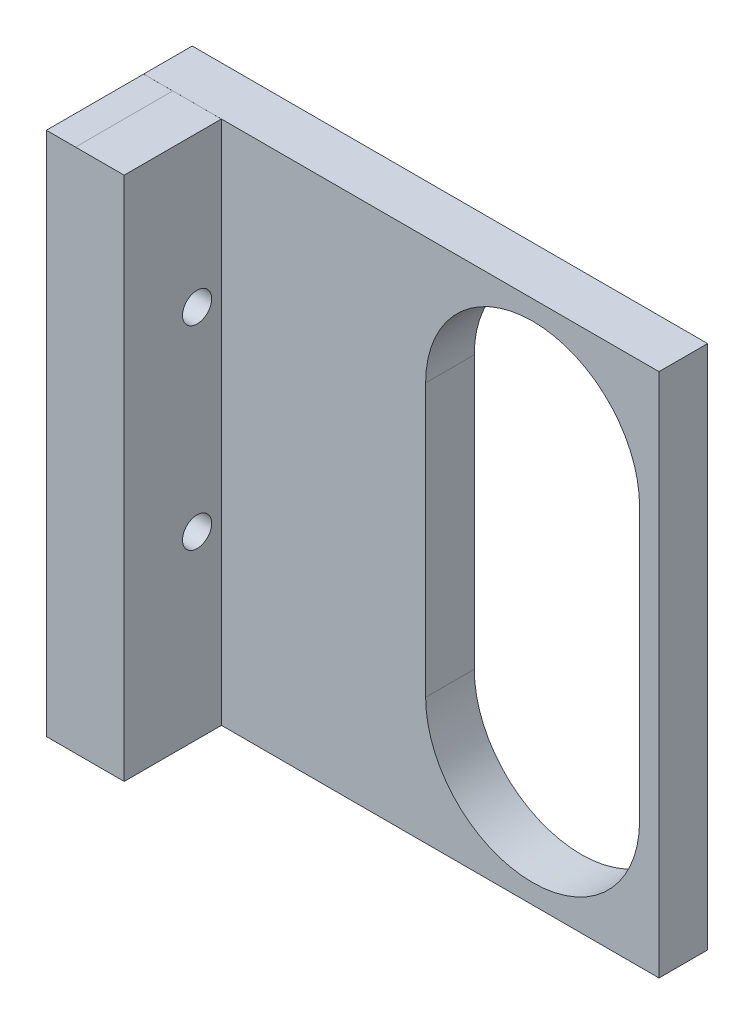
ISO-10303-21;
HEADER;
FILE_DESCRIPTION(('STEP AP214'),'2;1');
FILE_NAME('part.step','',(''),(''),'','','');
FILE_SCHEMA(('AUTOMOTIVE_DESIGN { 1 0 10303 214 1 1 1 1 }'));
ENDSEC;
DATA;
#1=APPLICATION_CONTEXT('core data for automotive mechanical design processes');
#2=APPLICATION_PROTOCOL_DEFINITION('international standard','automotive_design',2000,#1);
#3=PRODUCT_CONTEXT('',#1,'mechanical');
#4=PRODUCT('Part','Part','',(#3));
#5=PRODUCT_RELATED_PRODUCT_CATEGORY('part','',(#4));
#6=PRODUCT_DEFINITION_FORMATION('','',#4);
#7=PRODUCT_DEFINITION_CONTEXT('part definition',#1,'design');
#8=PRODUCT_DEFINITION('design','',#6,#7);
#9=PRODUCT_DEFINITION_SHAPE('','',#8);
#10=(LENGTH_UNIT() NAMED_UNIT(*) SI_UNIT(.MILLI.,.METRE.));
#11=(NAMED_UNIT(*) PLANE_ANGLE_UNIT() SI_UNIT($,.RADIAN.));
#12=(NAMED_UNIT(*) SI_UNIT($,.STERADIAN.) SOLID_ANGLE_UNIT());
#13=UNCERTAINTY_MEASURE_WITH_UNIT(LENGTH_MEASURE(1.E-05),#10,'distance_accuracy_value','');
#14=(GEOMETRIC_REPRESENTATION_CONTEXT(3) GLOBAL_UNCERTAINTY_ASSIGNED_CONTEXT((#13)) GLOBAL_UNIT_ASSIGNED_CONTEXT((#10,
#11,#12)) REPRESENTATION_CONTEXT('',''));
#15=CARTESIAN_POINT('',(0.,0.,0.));
#16=DIRECTION('',(0.,0.,1.));
#17=DIRECTION('',(1.,0.,0.));
#18=AXIS2_PLACEMENT_3D('',#15,#16,#17);
#19=CARTESIAN_POINT('',(0.,0.,5.));
#20=DIRECTION('',(0.,0.,-1.));
#21=DIRECTION('',(-1.,0.,0.));
#22=AXIS2_PLACEMENT_3D('',#19,#20,#21);
#23=PLANE('',#22);
#24=CARTESIAN_POINT('',(0.,17.25,5.));
#25=DIRECTION('',(0.,0.,1.));
#26=DIRECTION('',(1.,0.,0.));
#27=AXIS2_PLACEMENT_3D('',#24,#25,#26);
#28=CIRCLE('',#27,11.);
#29=CARTESIAN_POINT('',(-11.,17.25,5.));
#30=VERTEX_POINT('',#29);
#31=CARTESIAN_POINT('',(11.,17.25,5.));
#32=VERTEX_POINT('',#31);
#33=EDGE_CURVE('E207',#30,#32,#28,.T.);
#34=ORIENTED_EDGE('',*,*,#33,.F.);
#35=DIRECTION('',(0.,-1.,0.));
#36=VECTOR('',#35,1.);
#37=CARTESIAN_POINT('',(-11.,17.25,5.));
#38=LINE('',#37,#36);
#39=CARTESIAN_POINT('',(-11.0000000000001,45.25,5.));
#40=VERTEX_POINT('',#39);
#41=EDGE_CURVE('E214',#40,#30,#38,.T.);
#42=ORIENTED_EDGE('',*,*,#41,.F.);
#43=CARTESIAN_POINT('',(0.,45.25,5.));
#44=DIRECTION('',(0.,0.,1.));
#45=DIRECTION('',(-1.,0.,0.));
#46=AXIS2_PLACEMENT_3D('',#43,#44,#45);
#47=CIRCLE('',#46,11.);
#48=CARTESIAN_POINT('',(11.,45.25,5.));
#49=VERTEX_POINT('',#48);
#50=EDGE_CURVE('E212',#49,#40,#47,.T.);
#51=ORIENTED_EDGE('',*,*,#50,.F.);
#52=DIRECTION('',(0.,1.,0.));
#53=VECTOR('',#52,1.);
#54=CARTESIAN_POINT('',(11.,17.25,5.));
#55=LINE('',#54,#53);
#56=EDGE_CURVE('E209',#32,#49,#55,.T.);
#57=ORIENTED_EDGE('',*,*,#56,.F.);
#58=EDGE_LOOP('',(#34,#42,#51,#57));
#59=FACE_BOUND('',#58,.T.);
#60=DIRECTION('',(-0.999999997348901,-7.28161993137363E-05,0.));
#61=VECTOR('',#60,1.);
#62=CARTESIAN_POINT('',(-32.0039320656313,58.2477961092334,5.00000000000019));
#63=LINE('',#62,#61);
#64=CARTESIAN_POINT('',(-32.0039320656313,58.2477961092334,5.00000000000019));
#65=VERTEX_POINT('',#64);
#66=CARTESIAN_POINT('',(-37.0039320523758,58.2474320282369,5.00000000000019));
#67=VERTEX_POINT('',#66);
#68=EDGE_CURVE('E182',#65,#67,#63,.T.);
#69=ORIENTED_EDGE('',*,*,#68,.F.);
#70=DIRECTION('',(-7.28161993136774E-05,0.999999997348901,0.));
#71=VECTOR('',#70,1.);
#72=CARTESIAN_POINT('',(-32.0039320656313,58.2477961092334,5.00000000000019));
#73=LINE('',#72,#71);
#74=CARTESIAN_POINT('',(-32.0000001513369,4.25,5.));
#75=VERTEX_POINT('',#74);
#76=EDGE_CURVE('E161',#75,#65,#73,.T.);
#77=ORIENTED_EDGE('',*,*,#76,.F.);
#78=DIRECTION('',(-1.,0.,0.));
#79=VECTOR('',#78,1.);
#80=CARTESIAN_POINT('',(12.9999998354076,4.25,5.));
#81=LINE('',#80,#79);
#82=CARTESIAN_POINT('',(12.9999998354076,4.25,5.));
#83=VERTEX_POINT('',#82);
#84=EDGE_CURVE('E236',#83,#75,#81,.T.);
#85=ORIENTED_EDGE('',*,*,#84,.F.);
#86=DIRECTION('',(-7.28161993137777E-05,0.999999997348901,0.));
#87=VECTOR('',#86,1.);
#88=CARTESIAN_POINT('',(12.9999998354076,4.25,5.));
#89=LINE('',#88,#87);
#90=CARTESIAN_POINT('',(12.9960677606447,58.2499998568406,5.));
#91=VERTEX_POINT('',#90);
#92=EDGE_CURVE('E244',#83,#91,#89,.T.);
#93=ORIENTED_EDGE('',*,*,#92,.T.);
#94=DIRECTION('',(1.,0.,0.));
#95=VECTOR('',#94,1.);
#96=CARTESIAN_POINT('',(-40.0039322393553,58.2499998568406,5.));
#97=LINE('',#96,#95);
#98=CARTESIAN_POINT('',(-40.0039322393553,58.2499998568406,5.));
#99=VERTEX_POINT('',#98);
#100=EDGE_CURVE('E241',#99,#91,#97,.T.);
#101=ORIENTED_EDGE('',*,*,#100,.F.);
#102=DIRECTION('',(-7.28161993137777E-05,0.999999997348901,0.));
#103=VECTOR('',#102,1.);
#104=CARTESIAN_POINT('',(-40.0000001645924,4.25,5.));
#105=LINE('',#104,#103);
#106=CARTESIAN_POINT('',(-40.0039320523758,58.2474320282368,5.0000000000001));
#107=VERTEX_POINT('',#106);
#108=EDGE_CURVE('E64',#107,#99,#105,.T.);
#109=ORIENTED_EDGE('',*,*,#108,.F.);
#110=DIRECTION('',(-1.,0.,0.));
#111=VECTOR('',#110,1.);
#112=CARTESIAN_POINT('',(-40.0039320523758,58.2474320282368,5.00000000000019));
#113=LINE('',#112,#111);
#114=EDGE_CURVE('E189',#67,#107,#113,.T.);
#115=ORIENTED_EDGE('',*,*,#114,.F.);
#116=EDGE_LOOP('',(#69,#77,#85,#93,#101,#109,#115));
#117=FACE_BOUND('',#116,.T.);
#118=ADVANCED_FACE('F45',(#59,#117),#23,.F.);
#119=CARTESIAN_POINT('',(0.,0.,0.));
#120=DIRECTION('',(0.,0.,-1.));
#121=DIRECTION('',(-1.,0.,0.));
#122=AXIS2_PLACEMENT_3D('',#119,#120,#121);
#123=PLANE('',#122);
#124=DIRECTION('',(-1.,0.,0.));
#125=VECTOR('',#124,1.);
#126=CARTESIAN_POINT('',(12.9999998354076,4.25,0.));
#127=LINE('',#126,#125);
#128=CARTESIAN_POINT('',(12.9999998354076,4.25,0.));
#129=VERTEX_POINT('',#128);
#130=CARTESIAN_POINT('',(-40.0000001645924,4.25,0.));
#131=VERTEX_POINT('',#130);
#132=EDGE_CURVE('E235',#129,#131,#127,.T.);
#133=ORIENTED_EDGE('',*,*,#132,.T.);
#134=DIRECTION('',(-7.28161993137777E-05,0.999999997348901,0.));
#135=VECTOR('',#134,1.);
#136=CARTESIAN_POINT('',(-40.0000001645924,4.25,0.));
#137=LINE('',#136,#135);
#138=CARTESIAN_POINT('',(-40.0039322393553,58.2499998568406,0.));
#139=VERTEX_POINT('',#138);
#140=EDGE_CURVE('E249',#131,#139,#137,.T.);
#141=ORIENTED_EDGE('',*,*,#140,.T.);
#142=DIRECTION('',(1.,0.,0.));
#143=VECTOR('',#142,1.);
#144=CARTESIAN_POINT('',(-40.0039322393553,58.2499998568406,0.));
#145=LINE('',#144,#143);
#146=CARTESIAN_POINT('',(12.9960677606447,58.2499998568406,0.));
#147=VERTEX_POINT('',#146);
#148=EDGE_CURVE('E252',#139,#147,#145,.T.);
#149=ORIENTED_EDGE('',*,*,#148,.T.);
#150=DIRECTION('',(-7.28161993137777E-05,0.999999997348901,0.));
#151=VECTOR('',#150,1.);
#152=CARTESIAN_POINT('',(12.9999998354076,4.25,0.));
#153=LINE('',#152,#151);
#154=EDGE_CURVE('E239',#129,#147,#153,.T.);
#155=ORIENTED_EDGE('',*,*,#154,.F.);
#156=EDGE_LOOP('',(#133,#141,#149,#155));
#157=FACE_BOUND('',#156,.T.);
#158=DIRECTION('',(0.,-1.,0.));
#159=VECTOR('',#158,1.);
#160=CARTESIAN_POINT('',(-11.,17.25,0.));
#161=LINE('',#160,#159);
#162=CARTESIAN_POINT('',(-11.0000000000001,45.25,0.));
#163=VERTEX_POINT('',#162);
#164=CARTESIAN_POINT('',(-11.,17.25,0.));
#165=VERTEX_POINT('',#164);
#166=EDGE_CURVE('E210',#163,#165,#161,.T.);
#167=ORIENTED_EDGE('',*,*,#166,.T.);
#168=CARTESIAN_POINT('',(0.,17.25,0.));
#169=DIRECTION('',(0.,0.,1.));
#170=DIRECTION('',(1.,0.,0.));
#171=AXIS2_PLACEMENT_3D('',#168,#169,#170);
#172=CIRCLE('',#171,11.);
#173=CARTESIAN_POINT('',(11.,17.25,0.));
#174=VERTEX_POINT('',#173);
#175=EDGE_CURVE('E206',#165,#174,#172,.T.);
#176=ORIENTED_EDGE('',*,*,#175,.T.);
#177=DIRECTION('',(0.,1.,0.));
#178=VECTOR('',#177,1.);
#179=CARTESIAN_POINT('',(11.,17.25,0.));
#180=LINE('',#179,#178);
#181=CARTESIAN_POINT('',(11.,45.25,0.));
#182=VERTEX_POINT('',#181);
#183=EDGE_CURVE('E219',#174,#182,#180,.T.);
#184=ORIENTED_EDGE('',*,*,#183,.T.);
#185=CARTESIAN_POINT('',(0.,45.25,0.));
#186=DIRECTION('',(0.,0.,1.));
#187=DIRECTION('',(-1.,0.,0.));
#188=AXIS2_PLACEMENT_3D('',#185,#186,#187);
#189=CIRCLE('',#188,11.);
#190=EDGE_CURVE('E222',#182,#163,#189,.T.);
#191=ORIENTED_EDGE('',*,*,#190,.T.);
#192=EDGE_LOOP('',(#167,#176,#184,#191));
#193=FACE_BOUND('',#192,.T.);
#194=ADVANCED_FACE('F310',(#157,#193),#123,.T.);
#195=CARTESIAN_POINT('',(12.9999998354076,4.25,5.));
#196=DIRECTION('',(0.,-1.,0.));
#197=DIRECTION('',(0.,0.,-1.));
#198=AXIS2_PLACEMENT_3D('',#195,#196,#197);
#199=PLANE('',#198);
#200=ORIENTED_EDGE('',*,*,#132,.F.);
#201=DIRECTION('',(0.,0.,-1.));
#202=VECTOR('',#201,1.);
#203=CARTESIAN_POINT('',(12.9999998354076,4.25,5.));
#204=LINE('',#203,#202);
#205=EDGE_CURVE('E11',#83,#129,#204,.T.);
#206=ORIENTED_EDGE('',*,*,#205,.F.);
#207=ORIENTED_EDGE('',*,*,#84,.T.);
#208=DIRECTION('',(-1.,0.,0.));
#209=VECTOR('',#208,1.);
#210=CARTESIAN_POINT('',(12.9999998354076,4.25,5.));
#211=LINE('',#210,#209);
#212=CARTESIAN_POINT('',(-37.0000001645924,4.25,5.));
#213=VERTEX_POINT('',#212);
#214=EDGE_CURVE('E177',#75,#213,#211,.T.);
#215=ORIENTED_EDGE('',*,*,#214,.T.);
#216=DIRECTION('',(0.,0.,-1.));
#217=VECTOR('',#216,1.);
#218=CARTESIAN_POINT('',(-37.0000001645924,4.25,15.0000000000002));
#219=LINE('',#218,#217);
#220=CARTESIAN_POINT('',(-37.0000001645924,4.25,15.0000000000002));
#221=VERTEX_POINT('',#220);
#222=EDGE_CURVE('E204',#221,#213,#219,.T.);
#223=ORIENTED_EDGE('',*,*,#222,.F.);
#224=DIRECTION('',(1.,0.,0.));
#225=VECTOR('',#224,1.);
#226=CARTESIAN_POINT('',(-40.0000001645924,4.25,15.0000000000002));
#227=LINE('',#226,#225);
#228=CARTESIAN_POINT('',(-40.0000001645924,4.25,15.0000000000002));
#229=VERTEX_POINT('',#228);
#230=EDGE_CURVE('E175',#229,#221,#227,.T.);
#231=ORIENTED_EDGE('',*,*,#230,.F.);
#232=DIRECTION('',(0.,0.,-1.));
#233=VECTOR('',#232,1.);
#234=CARTESIAN_POINT('',(-40.0000001645924,4.25,5.));
#235=LINE('',#234,#233);
#236=EDGE_CURVE('E246',#229,#131,#235,.T.);
#237=ORIENTED_EDGE('',*,*,#236,.T.);
#238=EDGE_LOOP('',(#200,#206,#207,#215,#223,#231,#237));
#239=FACE_BOUND('',#238,.T.);
#240=ADVANCED_FACE('F47',(#239),#199,.T.);
#241=CARTESIAN_POINT('',(12.9999998354076,4.25,5.));
#242=DIRECTION('',(-0.999999997348901,-7.28161993137776E-05,0.));
#243=DIRECTION('',(7.28161993137776E-05,-0.999999997348901,0.));
#244=AXIS2_PLACEMENT_3D('',#241,#242,#243);
#245=PLANE('',#244);
#246=ORIENTED_EDGE('',*,*,#154,.T.);
#247=DIRECTION('',(0.,0.,-1.));
#248=VECTOR('',#247,1.);
#249=CARTESIAN_POINT('',(12.9960677606447,58.2499998568406,5.));
#250=LINE('',#249,#248);
#251=EDGE_CURVE('E56',#91,#147,#250,.T.);
#252=ORIENTED_EDGE('',*,*,#251,.F.);
#253=ORIENTED_EDGE('',*,*,#92,.F.);
#254=ORIENTED_EDGE('',*,*,#205,.T.);
#255=EDGE_LOOP('',(#246,#252,#253,#254));
#256=FACE_BOUND('',#255,.T.);
#257=ADVANCED_FACE('F315',(#256),#245,.F.);
#258=CARTESIAN_POINT('',(-40.0039322393553,58.2499998568406,5.));
#259=DIRECTION('',(0.,1.,0.));
#260=DIRECTION('',(0.,0.,1.));
#261=AXIS2_PLACEMENT_3D('',#258,#259,#260);
#262=PLANE('',#261);
#263=ORIENTED_EDGE('',*,*,#148,.F.);
#264=DIRECTION('',(0.,0.,-1.));
#265=VECTOR('',#264,1.);
#266=CARTESIAN_POINT('',(-40.0039322393553,58.2499998568406,5.));
#267=LINE('',#266,#265);
#268=EDGE_CURVE('E258',#99,#139,#267,.T.);
#269=ORIENTED_EDGE('',*,*,#268,.F.);
#270=ORIENTED_EDGE('',*,*,#100,.T.);
#271=ORIENTED_EDGE('',*,*,#251,.T.);
#272=EDGE_LOOP('',(#263,#269,#270,#271));
#273=FACE_BOUND('',#272,.T.);
#274=ADVANCED_FACE('F318',(#273),#262,.T.);
#275=CARTESIAN_POINT('',(-40.0000001645924,4.25,5.));
#276=DIRECTION('',(-0.999999997348901,-7.28161993137776E-05,0.));
#277=DIRECTION('',(7.28161993137776E-05,-0.999999997348901,0.));
#278=AXIS2_PLACEMENT_3D('',#275,#276,#277);
#279=PLANE('',#278);
#280=CARTESIAN_POINT('',(-40.0028034012864,42.7474320693289,7.50000000000024));
#281=DIRECTION('',(-0.999999997348901,-7.28161993067947E-05,0.));
#282=DIRECTION('',(7.28161993067947E-05,-0.999999997348901,0.));
#283=AXIS2_PLACEMENT_3D('',#280,#281,#282);
#284=CIRCLE('',#283,1.5);
#285=CARTESIAN_POINT('',(-40.0026941769875,41.2474320733055,7.50000000000024));
#286=VERTEX_POINT('',#285);
#287=EDGE_CURVE('E186',#286,#286,#284,.T.);
#288=ORIENTED_EDGE('',*,*,#287,.F.);
#289=EDGE_LOOP('',(#288));
#290=FACE_BOUND('',#289,.T.);
#291=CARTESIAN_POINT('',(-40.0013470773003,22.7474321223509,7.50000000000031));
#292=DIRECTION('',(-0.999999997348901,-7.28161993067947E-05,0.));
#293=DIRECTION('',(7.28161993067947E-05,-0.999999997348901,0.));
#294=AXIS2_PLACEMENT_3D('',#291,#292,#293);
#295=CIRCLE('',#294,1.5);
#296=CARTESIAN_POINT('',(-40.0012378530013,21.2474321263275,7.50000000000031));
#297=VERTEX_POINT('',#296);
#298=EDGE_CURVE('E180',#297,#297,#295,.T.);
#299=ORIENTED_EDGE('',*,*,#298,.F.);
#300=EDGE_LOOP('',(#299));
#301=FACE_BOUND('',#300,.T.);
#302=ORIENTED_EDGE('',*,*,#140,.F.);
#303=ORIENTED_EDGE('',*,*,#236,.F.);
#304=DIRECTION('',(7.28161993137363E-05,-0.999999997348901,0.));
#305=VECTOR('',#304,1.);
#306=CARTESIAN_POINT('',(-40.0039320523758,58.2474320282368,15.0000000000002));
#307=LINE('',#306,#305);
#308=CARTESIAN_POINT('',(-40.0039320523758,58.2474320282368,15.0000000000002));
#309=VERTEX_POINT('',#308);
#310=EDGE_CURVE('E192',#309,#229,#307,.T.);
#311=ORIENTED_EDGE('',*,*,#310,.F.);
#312=DIRECTION('',(0.,0.,-1.));
#313=VECTOR('',#312,1.);
#314=CARTESIAN_POINT('',(-40.0039320523758,58.2474320282368,15.0000000000002));
#315=LINE('',#314,#313);
#316=EDGE_CURVE('E197',#309,#107,#315,.T.);
#317=ORIENTED_EDGE('',*,*,#316,.T.);
#318=ORIENTED_EDGE('',*,*,#108,.T.);
#319=ORIENTED_EDGE('',*,*,#268,.T.);
#320=EDGE_LOOP('',(#302,#303,#311,#317,#318,#319));
#321=FACE_BOUND('',#320,.T.);
#322=ADVANCED_FACE('F306',(#290,#301,#321),#279,.T.);
#323=CARTESIAN_POINT('',(0.,17.25,5.));
#324=DIRECTION('',(0.,0.,-1.));
#325=DIRECTION('',(-1.,0.,0.));
#326=AXIS2_PLACEMENT_3D('',#323,#324,#325);
#327=CYLINDRICAL_SURFACE('',#326,11.);
#328=ORIENTED_EDGE('',*,*,#175,.F.);
#329=DIRECTION('',(0.,0.,-1.));
#330=VECTOR('',#329,1.);
#331=CARTESIAN_POINT('',(-11.,17.25,5.));
#332=LINE('',#331,#330);
#333=EDGE_CURVE('E216',#30,#165,#332,.T.);
#334=ORIENTED_EDGE('',*,*,#333,.F.);
#335=ORIENTED_EDGE('',*,*,#33,.T.);
#336=DIRECTION('',(0.,0.,-1.));
#337=VECTOR('',#336,1.);
#338=CARTESIAN_POINT('',(11.,17.25,5.));
#339=LINE('',#338,#337);
#340=EDGE_CURVE('E232',#32,#174,#339,.T.);
#341=ORIENTED_EDGE('',*,*,#340,.T.);
#342=EDGE_LOOP('',(#328,#334,#335,#341));
#343=FACE_BOUND('',#342,.T.);
#344=ADVANCED_FACE('F302',(#343),#327,.F.);
#345=CARTESIAN_POINT('',(11.,17.25,5.));
#346=DIRECTION('',(-1.,0.,0.));
#347=DIRECTION('',(0.,-1.,0.));
#348=AXIS2_PLACEMENT_3D('',#345,#346,#347);
#349=PLANE('',#348);
#350=ORIENTED_EDGE('',*,*,#183,.F.);
#351=ORIENTED_EDGE('',*,*,#340,.F.);
#352=ORIENTED_EDGE('',*,*,#56,.T.);
#353=DIRECTION('',(0.,0.,-1.));
#354=VECTOR('',#353,1.);
#355=CARTESIAN_POINT('',(11.,45.25,5.));
#356=LINE('',#355,#354);
#357=EDGE_CURVE('E230',#49,#182,#356,.T.);
#358=ORIENTED_EDGE('',*,*,#357,.T.);
#359=EDGE_LOOP('',(#350,#351,#352,#358));
#360=FACE_BOUND('',#359,.T.);
#361=ADVANCED_FACE('F298',(#360),#349,.T.);
#362=CARTESIAN_POINT('',(0.,45.25,5.));
#363=DIRECTION('',(0.,0.,-1.));
#364=DIRECTION('',(-1.,0.,0.));
#365=AXIS2_PLACEMENT_3D('',#362,#363,#364);
#366=CYLINDRICAL_SURFACE('',#365,11.);
#367=ORIENTED_EDGE('',*,*,#190,.F.);
#368=ORIENTED_EDGE('',*,*,#357,.F.);
#369=ORIENTED_EDGE('',*,*,#50,.T.);
#370=DIRECTION('',(0.,0.,-1.));
#371=VECTOR('',#370,1.);
#372=CARTESIAN_POINT('',(-11.0000000000001,45.25,5.));
#373=LINE('',#372,#371);
#374=EDGE_CURVE('E72',#40,#163,#373,.T.);
#375=ORIENTED_EDGE('',*,*,#374,.T.);
#376=EDGE_LOOP('',(#367,#368,#369,#375));
#377=FACE_BOUND('',#376,.T.);
#378=ADVANCED_FACE('F295',(#377),#366,.F.);
#379=CARTESIAN_POINT('',(-11.,17.25,5.));
#380=DIRECTION('',(1.,0.,0.));
#381=DIRECTION('',(0.,1.,0.));
#382=AXIS2_PLACEMENT_3D('',#379,#380,#381);
#383=PLANE('',#382);
#384=ORIENTED_EDGE('',*,*,#166,.F.);
#385=ORIENTED_EDGE('',*,*,#374,.F.);
#386=ORIENTED_EDGE('',*,*,#41,.T.);
#387=ORIENTED_EDGE('',*,*,#333,.T.);
#388=EDGE_LOOP('',(#384,#385,#386,#387));
#389=FACE_BOUND('',#388,.T.);
#390=ADVANCED_FACE('F291',(#389),#383,.T.);
#391=CARTESIAN_POINT('',(-40.0039320523758,58.2474320282368,15.0000000000002));
#392=DIRECTION('',(0.,-1.,0.));
#393=DIRECTION('',(0.,0.,-1.));
#394=AXIS2_PLACEMENT_3D('',#391,#392,#393);
#395=PLANE('',#394);
#396=ORIENTED_EDGE('',*,*,#114,.T.);
#397=ORIENTED_EDGE('',*,*,#316,.F.);
#398=DIRECTION('',(-1.,0.,0.));
#399=VECTOR('',#398,1.);
#400=CARTESIAN_POINT('',(-40.0039320523758,58.2474320282368,15.0000000000002));
#401=LINE('',#400,#399);
#402=CARTESIAN_POINT('',(-37.0039320523758,58.2474320282368,15.0000000000002));
#403=VERTEX_POINT('',#402);
#404=EDGE_CURVE('E195',#403,#309,#401,.T.);
#405=ORIENTED_EDGE('',*,*,#404,.F.);
#406=DIRECTION('',(0.,0.,-1.));
#407=VECTOR('',#406,1.);
#408=CARTESIAN_POINT('',(-37.0039320523758,58.2474320282368,15.0000000000002));
#409=LINE('',#408,#407);
#410=EDGE_CURVE('E201',#403,#67,#409,.T.);
#411=ORIENTED_EDGE('',*,*,#410,.T.);
#412=EDGE_LOOP('',(#396,#397,#405,#411));
#413=FACE_BOUND('',#412,.T.);
#414=ADVANCED_FACE('F288',(#413),#395,.F.);
#415=CARTESIAN_POINT('',(0.,0.,15.0000000000002));
#416=DIRECTION('',(0.,0.,1.));
#417=DIRECTION('',(1.,0.,0.));
#418=AXIS2_PLACEMENT_3D('',#415,#416,#417);
#419=PLANE('',#418);
#420=ORIENTED_EDGE('',*,*,#310,.T.);
#421=ORIENTED_EDGE('',*,*,#230,.T.);
#422=DIRECTION('',(-0.999999997348901,-7.28161993137363E-05,0.));
#423=VECTOR('',#422,1.);
#424=CARTESIAN_POINT('',(-32.0000001778479,4.25036408099657,15.0000000000002));
#425=LINE('',#424,#423);
#426=CARTESIAN_POINT('',(-32.0000001778479,4.25036408099657,15.0000000000002));
#427=VERTEX_POINT('',#426);
#428=EDGE_CURVE('E154',#427,#221,#425,.T.);
#429=ORIENTED_EDGE('',*,*,#428,.F.);
#430=DIRECTION('',(7.28161993137363E-05,-0.999999997348901,0.));
#431=VECTOR('',#430,1.);
#432=CARTESIAN_POINT('',(-32.0000001778479,4.25036408099657,15.0000000000002));
#433=LINE('',#432,#431);
#434=CARTESIAN_POINT('',(-32.0039320656313,58.2477961092334,15.0000000000002));
#435=VERTEX_POINT('',#434);
#436=EDGE_CURVE('E162',#435,#427,#433,.T.);
#437=ORIENTED_EDGE('',*,*,#436,.F.);
#438=DIRECTION('',(-0.999999997348901,-7.28161993137363E-05,0.));
#439=VECTOR('',#438,1.);
#440=CARTESIAN_POINT('',(-32.0039320656313,58.2477961092334,15.0000000000002));
#441=LINE('',#440,#439);
#442=EDGE_CURVE('E346',#435,#403,#441,.T.);
#443=ORIENTED_EDGE('',*,*,#442,.T.);
#444=ORIENTED_EDGE('',*,*,#404,.T.);
#445=EDGE_LOOP('',(#420,#421,#429,#437,#443,#444));
#446=FACE_BOUND('',#445,.T.);
#447=ADVANCED_FACE('F173',(#446),#419,.T.);
#448=CARTESIAN_POINT('',(13.003584789236,22.7512917400441,7.50000000000031));
#449=DIRECTION('',(-0.999999997348901,-7.28161993067947E-05,0.));
#450=DIRECTION('',(7.28161993067947E-05,-0.999999997348901,0.));
#451=AXIS2_PLACEMENT_3D('',#448,#449,#450);
#452=CYLINDRICAL_SURFACE('',#451,1.5);
#453=ORIENTED_EDGE('',*,*,#298,.T.);
#454=EDGE_LOOP('',(#453));
#455=FACE_BOUND('',#454,.T.);
#456=CARTESIAN_POINT('',(-37.0013470932068,22.7476505709482,7.50000000000031));
#457=DIRECTION('',(0.999999997348901,7.28161993067947E-05,0.));
#458=DIRECTION('',(7.28161993109506E-05,-0.999999997348901,0.));
#459=AXIS2_PLACEMENT_3D('',#456,#457,#458);
#460=CIRCLE('',#459,1.5);
#461=CARTESIAN_POINT('',(-37.0012378689078,21.2476505749249,7.50000000000031));
#462=VERTEX_POINT('',#461);
#463=EDGE_CURVE('E555',#462,#462,#460,.T.);
#464=ORIENTED_EDGE('',*,*,#463,.T.);
#465=EDGE_LOOP('',(#464));
#466=FACE_BOUND('',#465,.T.);
#467=ADVANCED_FACE('F279',(#455,#466),#452,.F.);
#468=CARTESIAN_POINT('',(13.0021284652499,42.7512916870221,7.50000000000024));
#469=DIRECTION('',(-0.999999997348901,-7.28161993067947E-05,0.));
#470=DIRECTION('',(7.28161993067947E-05,-0.999999997348901,0.));
#471=AXIS2_PLACEMENT_3D('',#468,#469,#470);
#472=CYLINDRICAL_SURFACE('',#471,1.5);
#473=ORIENTED_EDGE('',*,*,#287,.T.);
#474=EDGE_LOOP('',(#473));
#475=FACE_BOUND('',#474,.T.);
#476=CARTESIAN_POINT('',(-37.0028034171931,42.7476505179262,7.50000000000024));
#477=DIRECTION('',(0.999999997348901,7.28161993067947E-05,0.));
#478=DIRECTION('',(7.28161993109508E-05,-0.999999997348901,0.));
#479=AXIS2_PLACEMENT_3D('',#476,#477,#478);
#480=CIRCLE('',#479,1.5);
#481=CARTESIAN_POINT('',(-37.0026941928941,41.2476505219029,7.50000000000024));
#482=VERTEX_POINT('',#481);
#483=EDGE_CURVE('E265',#482,#482,#480,.T.);
#484=ORIENTED_EDGE('',*,*,#483,.T.);
#485=EDGE_LOOP('',(#484));
#486=FACE_BOUND('',#485,.T.);
#487=ADVANCED_FACE('F270',(#475,#486),#472,.F.);
#488=CARTESIAN_POINT('',(-31.9999999127379,4.24672327104054,5.));
#489=DIRECTION('',(-7.28161944876622E-05,0.999999931071421,-0.000364080972438297));
#490=DIRECTION('',(0.,0.000364080973403512,0.99999993372252));
#491=AXIS2_PLACEMENT_3D('',#488,#489,#490);
#492=PLANE('',#491);
#493=DIRECTION('',(2.65109923373706E-08,-0.000364080971473082,-0.99999993372252));
#494=VECTOR('',#493,1.);
#495=CARTESIAN_POINT('',(-36.9999998994824,4.24635919004397,5.));
#496=LINE('',#495,#494);
#497=CARTESIAN_POINT('',(-36.9999998994824,4.24635919004397,5.));
#498=VERTEX_POINT('',#497);
#499=EDGE_CURVE('E351',#221,#498,#496,.T.);
#500=ORIENTED_EDGE('',*,*,#499,.T.);
#501=DIRECTION('',(-0.999999997348901,-7.28161993137363E-05,0.));
#502=VECTOR('',#501,1.);
#503=CARTESIAN_POINT('',(-31.9999999127379,4.24672327104054,5.));
#504=LINE('',#503,#502);
#505=CARTESIAN_POINT('',(-31.9999999127379,4.24672327104054,5.));
#506=VERTEX_POINT('',#505);
#507=EDGE_CURVE('E157',#506,#498,#504,.T.);
#508=ORIENTED_EDGE('',*,*,#507,.F.);
#509=DIRECTION('',(2.65109923373706E-08,-0.000364080971473082,-0.99999993372252));
#510=VECTOR('',#509,1.);
#511=CARTESIAN_POINT('',(-31.9999999127379,4.24672327104054,5.));
#512=LINE('',#511,#510);
#513=EDGE_CURVE('E150',#427,#506,#512,.T.);
#514=ORIENTED_EDGE('',*,*,#513,.F.);
#515=ORIENTED_EDGE('',*,*,#428,.T.);
#516=EDGE_LOOP('',(#500,#508,#514,#515));
#517=FACE_BOUND('',#516,.T.);
#518=ADVANCED_FACE('F152',(#517),#492,.F.);
#519=CARTESIAN_POINT('',(-32.0039320656313,58.2477961092334,5.00000000000019));
#520=DIRECTION('',(0.,0.,1.));
#521=DIRECTION('',(0.,-1.,0.));
#522=AXIS2_PLACEMENT_3D('',#519,#520,#521);
#523=PLANE('',#522);
#524=ORIENTED_EDGE('',*,*,#214,.F.);
#525=EDGE_CURVE('E354',#506,#75,#73,.T.);
#526=ORIENTED_EDGE('',*,*,#525,.F.);
#527=ORIENTED_EDGE('',*,*,#507,.T.);
#528=DIRECTION('',(-7.28161993136774E-05,0.999999997348901,0.));
#529=VECTOR('',#528,1.);
#530=CARTESIAN_POINT('',(-37.0039320523758,58.2474320282369,5.00000000000019));
#531=LINE('',#530,#529);
#532=EDGE_CURVE('E170',#498,#213,#531,.T.);
#533=ORIENTED_EDGE('',*,*,#532,.T.);
#534=EDGE_LOOP('',(#524,#526,#527,#533));
#535=FACE_BOUND('',#534,.T.);
#536=ADVANCED_FACE('F384',(#535),#523,.F.);
#537=CARTESIAN_POINT('',(-32.0039320656313,58.2477961092334,15.0000000000002));
#538=DIRECTION('',(7.28161993137363E-05,-0.999999997348901,0.));
#539=DIRECTION('',(0.999999997348901,7.28161993137363E-05,0.));
#540=AXIS2_PLACEMENT_3D('',#537,#538,#539);
#541=PLANE('',#540);
#542=ORIENTED_EDGE('',*,*,#410,.F.);
#543=ORIENTED_EDGE('',*,*,#442,.F.);
#544=DIRECTION('',(0.,0.,1.));
#545=VECTOR('',#544,1.);
#546=CARTESIAN_POINT('',(-32.0039320656313,58.2477961092334,15.0000000000002));
#547=LINE('',#546,#545);
#548=EDGE_CURVE('E167',#65,#435,#547,.T.);
#549=ORIENTED_EDGE('',*,*,#548,.F.);
#550=ORIENTED_EDGE('',*,*,#68,.T.);
#551=EDGE_LOOP('',(#542,#543,#549,#550));
#552=FACE_BOUND('',#551,.T.);
#553=ADVANCED_FACE('F378',(#552),#541,.F.);
#554=CARTESIAN_POINT('',(-31.9996905128203,-0.00233009584853671,0.));
#555=DIRECTION('',(-0.999999997348901,-7.28161993137363E-05,0.));
#556=DIRECTION('',(7.28161993137363E-05,-0.999999997348901,0.));
#557=AXIS2_PLACEMENT_3D('',#554,#555,#556);
#558=PLANE('',#557);
#559=CARTESIAN_POINT('',(-32.002803414542,42.7477961503255,7.50000000000014));
#560=DIRECTION('',(0.999999997348901,7.28161993137364E-05,0.));
#561=DIRECTION('',(-7.28161993137364E-05,0.999999997348901,0.));
#562=AXIS2_PLACEMENT_3D('',#559,#560,#561);
#563=CIRCLE('',#562,1.5);
#564=CARTESIAN_POINT('',(-32.0029126388409,44.2477961463488,7.50000000000014));
#565=VERTEX_POINT('',#564);
#566=EDGE_CURVE('E551',#565,#565,#563,.T.);
#567=ORIENTED_EDGE('',*,*,#566,.F.);
#568=EDGE_LOOP('',(#567));
#569=FACE_BOUND('',#568,.T.);
#570=CARTESIAN_POINT('',(-32.0013470905557,22.7477962033475,7.50000000000007));
#571=DIRECTION('',(0.999999997348901,7.28161993137364E-05,0.));
#572=DIRECTION('',(-7.28161993137364E-05,0.999999997348901,0.));
#573=AXIS2_PLACEMENT_3D('',#570,#571,#572);
#574=CIRCLE('',#573,1.5);
#575=CARTESIAN_POINT('',(-32.0014563148547,24.2477961993708,7.50000000000007));
#576=VERTEX_POINT('',#575);
#577=EDGE_CURVE('E552',#576,#576,#574,.T.);
#578=ORIENTED_EDGE('',*,*,#577,.F.);
#579=EDGE_LOOP('',(#578));
#580=FACE_BOUND('',#579,.T.);
#581=ORIENTED_EDGE('',*,*,#436,.T.);
#582=ORIENTED_EDGE('',*,*,#513,.T.);
#583=ORIENTED_EDGE('',*,*,#525,.T.);
#584=ORIENTED_EDGE('',*,*,#76,.T.);
#585=ORIENTED_EDGE('',*,*,#548,.T.);
#586=EDGE_LOOP('',(#581,#582,#583,#584,#585));
#587=FACE_BOUND('',#586,.T.);
#588=ADVANCED_FACE('F165',(#569,#580,#587),#558,.F.);
#589=CARTESIAN_POINT('',(-36.9996904995648,-0.0026941768451054,0.));
#590=DIRECTION('',(-0.999999997348901,-7.28161993137363E-05,0.));
#591=DIRECTION('',(7.28161993137363E-05,-0.999999997348901,0.));
#592=AXIS2_PLACEMENT_3D('',#589,#590,#591);
#593=PLANE('',#592);
#594=ORIENTED_EDGE('',*,*,#499,.F.);
#595=ORIENTED_EDGE('',*,*,#222,.T.);
#596=ORIENTED_EDGE('',*,*,#532,.F.);
#597=EDGE_LOOP('',(#594,#595,#596));
#598=FACE_BOUND('',#597,.T.);
#599=ADVANCED_FACE('F373',(#598),#593,.T.);
#600=CARTESIAN_POINT('',(-37.0013470773002,22.7474321223509,7.50000000000007));
#601=DIRECTION('',(0.999999997348901,7.28161993137363E-05,0.));
#602=DIRECTION('',(-7.28161993137363E-05,0.999999997348901,0.));
#603=AXIS2_PLACEMENT_3D('',#600,#601,#602);
#604=CYLINDRICAL_SURFACE('',#603,1.5);
#605=ORIENTED_EDGE('',*,*,#463,.F.);
#606=EDGE_LOOP('',(#605));
#607=FACE_BOUND('',#606,.T.);
#608=ORIENTED_EDGE('',*,*,#577,.T.);
#609=EDGE_LOOP('',(#608));
#610=FACE_BOUND('',#609,.T.);
#611=ADVANCED_FACE('F362',(#607,#610),#604,.F.);
#612=CARTESIAN_POINT('',(-37.0028034012865,42.7474320693289,7.50000000000014));
#613=DIRECTION('',(0.999999997348901,7.28161993137363E-05,0.));
#614=DIRECTION('',(-7.28161993137363E-05,0.999999997348901,0.));
#615=AXIS2_PLACEMENT_3D('',#612,#613,#614);
#616=CYLINDRICAL_SURFACE('',#615,1.5);
#617=ORIENTED_EDGE('',*,*,#483,.F.);
#618=EDGE_LOOP('',(#617));
#619=FACE_BOUND('',#618,.T.);
#620=ORIENTED_EDGE('',*,*,#566,.T.);
#621=EDGE_LOOP('',(#620));
#622=FACE_BOUND('',#621,.T.);
#623=ADVANCED_FACE('F372',(#619,#622),#616,.F.);
#624=CLOSED_SHELL('',(#118,#194,#240,#257,#274,#322,#344,#361,#378,#390,#414,#447,#467,#487,
#518,#536,#553,#588,#599,#611,#623));
#625=MANIFOLD_SOLID_BREP('B2',#624);
#626=ADVANCED_BREP_SHAPE_REPRESENTATION('',(#18,#625),#14);
#627=SHAPE_DEFINITION_REPRESENTATION(#9,#626);
ENDSEC;
END-ISO-10303-21;
